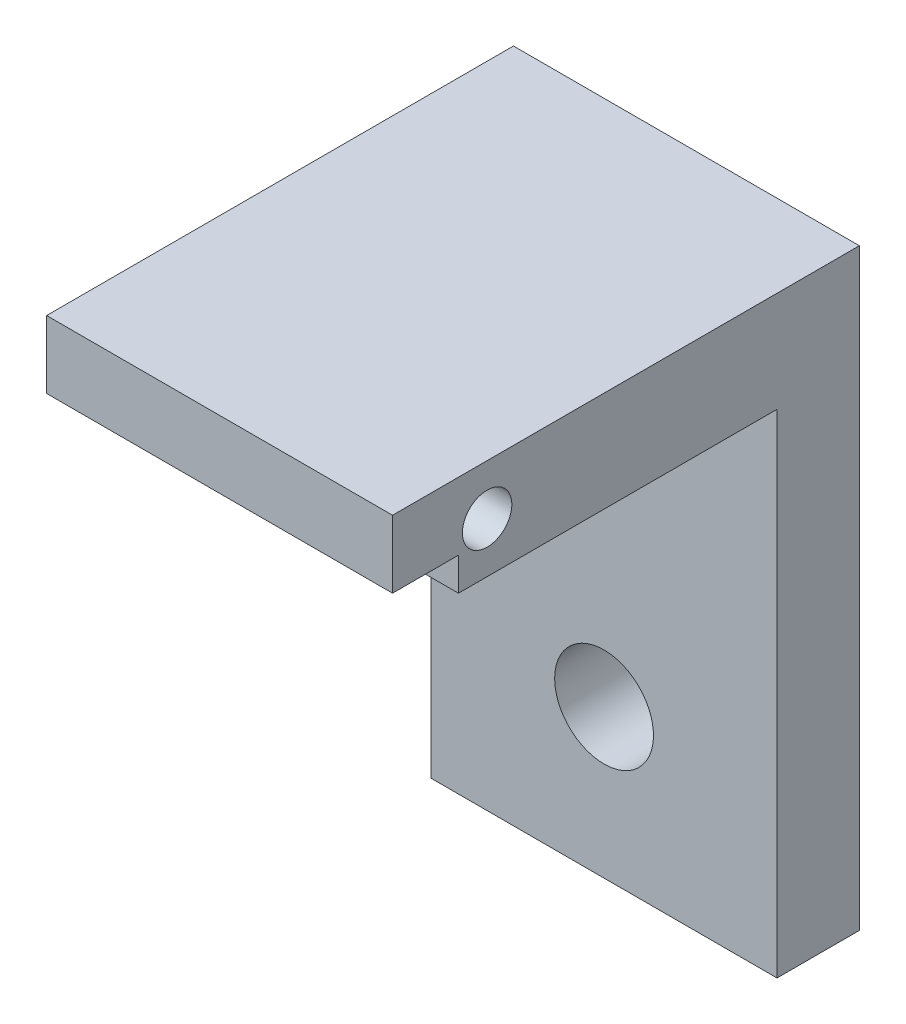
ISO-10303-21;
HEADER;
FILE_DESCRIPTION(('STEP AP214'),'2;1');
FILE_NAME('part.step','',(''),(''),'','','');
FILE_SCHEMA(('AUTOMOTIVE_DESIGN { 1 0 10303 214 1 1 1 1 }'));
ENDSEC;
DATA;
#1=APPLICATION_CONTEXT('core data for automotive mechanical design processes');
#2=APPLICATION_PROTOCOL_DEFINITION('international standard','automotive_design',2000,#1);
#3=PRODUCT_CONTEXT('',#1,'mechanical');
#4=PRODUCT('Part','Part','',(#3));
#5=PRODUCT_RELATED_PRODUCT_CATEGORY('part','',(#4));
#6=PRODUCT_DEFINITION_FORMATION('','',#4);
#7=PRODUCT_DEFINITION_CONTEXT('part definition',#1,'design');
#8=PRODUCT_DEFINITION('design','',#6,#7);
#9=PRODUCT_DEFINITION_SHAPE('','',#8);
#10=(LENGTH_UNIT() NAMED_UNIT(*) SI_UNIT(.MILLI.,.METRE.));
#11=(NAMED_UNIT(*) PLANE_ANGLE_UNIT() SI_UNIT($,.RADIAN.));
#12=(NAMED_UNIT(*) SI_UNIT($,.STERADIAN.) SOLID_ANGLE_UNIT());
#13=UNCERTAINTY_MEASURE_WITH_UNIT(LENGTH_MEASURE(1.E-05),#10,'distance_accuracy_value','');
#14=(GEOMETRIC_REPRESENTATION_CONTEXT(3) GLOBAL_UNCERTAINTY_ASSIGNED_CONTEXT((#13)) GLOBAL_UNIT_ASSIGNED_CONTEXT((#10,
#11,#12)) REPRESENTATION_CONTEXT('',''));
#15=CARTESIAN_POINT('',(0.,0.,0.));
#16=DIRECTION('',(0.,0.,1.));
#17=DIRECTION('',(1.,0.,0.));
#18=AXIS2_PLACEMENT_3D('',#15,#16,#17);
#19=CARTESIAN_POINT('',(-5.25000000000001,18.,2.5));
#20=DIRECTION('',(0.,0.,-1.));
#21=DIRECTION('',(-1.,0.,0.));
#22=AXIS2_PLACEMENT_3D('',#19,#20,#21);
#23=PLANE('',#22);
#24=CARTESIAN_POINT('',(0.,4.5,2.5));
#25=DIRECTION('',(0.,0.,-1.));
#26=DIRECTION('',(-1.,0.,0.));
#27=AXIS2_PLACEMENT_3D('',#24,#25,#26);
#28=CIRCLE('',#27,1.5);
#29=CARTESIAN_POINT('',(-1.5,4.5,2.5));
#30=VERTEX_POINT('',#29);
#31=EDGE_CURVE('E148',#30,#30,#28,.T.);
#32=ORIENTED_EDGE('',*,*,#31,.T.);
#33=EDGE_LOOP('',(#32));
#34=FACE_BOUND('',#33,.T.);
#35=DIRECTION('',(0.,-1.,0.));
#36=VECTOR('',#35,1.);
#37=CARTESIAN_POINT('',(5.24999999999999,18.,2.5));
#38=LINE('',#37,#36);
#39=CARTESIAN_POINT('',(5.24999999999999,14.95,2.5));
#40=VERTEX_POINT('',#39);
#41=CARTESIAN_POINT('',(5.24999999999999,0.,2.5));
#42=VERTEX_POINT('',#41);
#43=EDGE_CURVE('E184',#40,#42,#38,.T.);
#44=ORIENTED_EDGE('',*,*,#43,.F.);
#45=DIRECTION('',(-1.,0.,0.));
#46=VECTOR('',#45,1.);
#47=CARTESIAN_POINT('',(-5.25000000000001,14.95,2.5));
#48=LINE('',#47,#46);
#49=CARTESIAN_POINT('',(-5.25000000000001,14.95,2.5));
#50=VERTEX_POINT('',#49);
#51=EDGE_CURVE('E165',#40,#50,#48,.T.);
#52=ORIENTED_EDGE('',*,*,#51,.T.);
#53=DIRECTION('',(0.,-1.,0.));
#54=VECTOR('',#53,1.);
#55=CARTESIAN_POINT('',(-5.25000000000001,18.,2.5));
#56=LINE('',#55,#54);
#57=CARTESIAN_POINT('',(-5.25000000000001,0.,2.5));
#58=VERTEX_POINT('',#57);
#59=EDGE_CURVE('E54',#50,#58,#56,.T.);
#60=ORIENTED_EDGE('',*,*,#59,.T.);
#61=DIRECTION('',(1.,0.,0.));
#62=VECTOR('',#61,1.);
#63=CARTESIAN_POINT('',(-5.25000000000001,0.,2.5));
#64=LINE('',#63,#62);
#65=EDGE_CURVE('E181',#58,#42,#64,.T.);
#66=ORIENTED_EDGE('',*,*,#65,.T.);
#67=EDGE_LOOP('',(#44,#52,#60,#66));
#68=FACE_BOUND('',#67,.T.);
#69=ADVANCED_FACE('F45',(#34,#68),#23,.F.);
#70=CARTESIAN_POINT('',(5.24999999999999,18.,2.5));
#71=DIRECTION('',(-1.,0.,0.));
#72=DIRECTION('',(0.,0.,1.));
#73=AXIS2_PLACEMENT_3D('',#70,#71,#72);
#74=PLANE('',#73);
#75=CARTESIAN_POINT('',(5.24999999999999,16.475,11.3));
#76=DIRECTION('',(-1.,0.,0.));
#77=DIRECTION('',(0.,0.,1.));
#78=AXIS2_PLACEMENT_3D('',#75,#76,#77);
#79=CIRCLE('',#78,0.75);
#80=CARTESIAN_POINT('',(5.24999999999999,16.475,12.05));
#81=VERTEX_POINT('',#80);
#82=EDGE_CURVE('E132',#81,#81,#79,.T.);
#83=ORIENTED_EDGE('',*,*,#82,.T.);
#84=EDGE_LOOP('',(#83));
#85=FACE_BOUND('',#84,.T.);
#86=DIRECTION('',(0.,0.,-1.));
#87=VECTOR('',#86,1.);
#88=CARTESIAN_POINT('',(5.24999999999999,15.95,2.5));
#89=LINE('',#88,#87);
#90=CARTESIAN_POINT('',(5.24999999999999,15.95,14.17));
#91=VERTEX_POINT('',#90);
#92=CARTESIAN_POINT('',(5.24999999999999,15.95,12.17));
#93=VERTEX_POINT('',#92);
#94=EDGE_CURVE('E60',#91,#93,#89,.T.);
#95=ORIENTED_EDGE('',*,*,#94,.T.);
#96=DIRECTION('',(0.,-1.,0.));
#97=VECTOR('',#96,1.);
#98=CARTESIAN_POINT('',(5.24999999999999,18.,12.17));
#99=LINE('',#98,#97);
#100=CARTESIAN_POINT('',(5.24999999999999,14.95,12.17));
#101=VERTEX_POINT('',#100);
#102=EDGE_CURVE('E219',#93,#101,#99,.T.);
#103=ORIENTED_EDGE('',*,*,#102,.T.);
#104=DIRECTION('',(0.,0.,1.));
#105=VECTOR('',#104,1.);
#106=CARTESIAN_POINT('',(5.24999999999999,14.95,2.5));
#107=LINE('',#106,#105);
#108=EDGE_CURVE('E169',#40,#101,#107,.T.);
#109=ORIENTED_EDGE('',*,*,#108,.F.);
#110=ORIENTED_EDGE('',*,*,#43,.T.);
#111=DIRECTION('',(0.,0.,-1.));
#112=VECTOR('',#111,1.);
#113=CARTESIAN_POINT('',(5.24999999999999,0.,2.5));
#114=LINE('',#113,#112);
#115=CARTESIAN_POINT('',(5.24999999999999,0.,0.));
#116=VERTEX_POINT('',#115);
#117=EDGE_CURVE('E173',#42,#116,#114,.T.);
#118=ORIENTED_EDGE('',*,*,#117,.T.);
#119=DIRECTION('',(0.,-1.,0.));
#120=VECTOR('',#119,1.);
#121=CARTESIAN_POINT('',(5.24999999999999,26.3,0.));
#122=LINE('',#121,#120);
#123=CARTESIAN_POINT('',(5.24999999999999,18.,0.));
#124=VERTEX_POINT('',#123);
#125=EDGE_CURVE('E68',#124,#116,#122,.T.);
#126=ORIENTED_EDGE('',*,*,#125,.F.);
#127=DIRECTION('',(0.,0.,-1.));
#128=VECTOR('',#127,1.);
#129=CARTESIAN_POINT('',(5.24999999999999,18.,2.5));
#130=LINE('',#129,#128);
#131=CARTESIAN_POINT('',(5.24999999999999,18.,14.17));
#132=VERTEX_POINT('',#131);
#133=EDGE_CURVE('E177',#132,#124,#130,.T.);
#134=ORIENTED_EDGE('',*,*,#133,.F.);
#135=DIRECTION('',(0.,1.,0.));
#136=VECTOR('',#135,1.);
#137=CARTESIAN_POINT('',(5.24999999999999,18.,14.17));
#138=LINE('',#137,#136);
#139=EDGE_CURVE('E131',#91,#132,#138,.T.);
#140=ORIENTED_EDGE('',*,*,#139,.F.);
#141=EDGE_LOOP('',(#95,#103,#109,#110,#118,#126,#134,#140));
#142=FACE_BOUND('',#141,.T.);
#143=ADVANCED_FACE('F47',(#85,#142),#74,.F.);
#144=CARTESIAN_POINT('',(-5.25000000000001,18.,2.5));
#145=DIRECTION('',(1.,0.,0.));
#146=DIRECTION('',(0.,0.,-1.));
#147=AXIS2_PLACEMENT_3D('',#144,#145,#146);
#148=PLANE('',#147);
#149=CARTESIAN_POINT('',(-5.25000000000001,16.475,11.3));
#150=DIRECTION('',(-1.,0.,0.));
#151=DIRECTION('',(0.,0.,1.));
#152=AXIS2_PLACEMENT_3D('',#149,#150,#151);
#153=CIRCLE('',#152,0.75);
#154=CARTESIAN_POINT('',(-5.25000000000001,16.475,12.05));
#155=VERTEX_POINT('',#154);
#156=EDGE_CURVE('E138',#155,#155,#153,.T.);
#157=ORIENTED_EDGE('',*,*,#156,.F.);
#158=EDGE_LOOP('',(#157));
#159=FACE_BOUND('',#158,.T.);
#160=DIRECTION('',(0.,0.,1.));
#161=VECTOR('',#160,1.);
#162=CARTESIAN_POINT('',(-5.25000000000001,14.95,2.5));
#163=LINE('',#162,#161);
#164=CARTESIAN_POINT('',(-5.25000000000001,14.95,12.17));
#165=VERTEX_POINT('',#164);
#166=EDGE_CURVE('E170',#50,#165,#163,.T.);
#167=ORIENTED_EDGE('',*,*,#166,.T.);
#168=DIRECTION('',(0.,-1.,0.));
#169=VECTOR('',#168,1.);
#170=CARTESIAN_POINT('',(-5.25000000000001,14.95,12.17));
#171=LINE('',#170,#169);
#172=CARTESIAN_POINT('',(-5.25000000000001,15.95,12.17));
#173=VERTEX_POINT('',#172);
#174=EDGE_CURVE('E123',#173,#165,#171,.T.);
#175=ORIENTED_EDGE('',*,*,#174,.F.);
#176=DIRECTION('',(0.,0.,-1.));
#177=VECTOR('',#176,1.);
#178=CARTESIAN_POINT('',(-5.25000000000001,15.95,14.17));
#179=LINE('',#178,#177);
#180=CARTESIAN_POINT('',(-5.25000000000001,15.95,14.17));
#181=VERTEX_POINT('',#180);
#182=EDGE_CURVE('E112',#181,#173,#179,.T.);
#183=ORIENTED_EDGE('',*,*,#182,.F.);
#184=DIRECTION('',(0.,-1.,0.));
#185=VECTOR('',#184,1.);
#186=CARTESIAN_POINT('',(-5.25000000000001,18.,14.17));
#187=LINE('',#186,#185);
#188=CARTESIAN_POINT('',(-5.25000000000001,18.,14.17));
#189=VERTEX_POINT('',#188);
#190=EDGE_CURVE('E122',#189,#181,#187,.T.);
#191=ORIENTED_EDGE('',*,*,#190,.F.);
#192=DIRECTION('',(0.,0.,1.));
#193=VECTOR('',#192,1.);
#194=CARTESIAN_POINT('',(-5.25000000000001,18.,2.5));
#195=LINE('',#194,#193);
#196=CARTESIAN_POINT('',(-5.25000000000001,18.,0.));
#197=VERTEX_POINT('',#196);
#198=EDGE_CURVE('E180',#197,#189,#195,.T.);
#199=ORIENTED_EDGE('',*,*,#198,.F.);
#200=DIRECTION('',(0.,-1.,0.));
#201=VECTOR('',#200,1.);
#202=CARTESIAN_POINT('',(-5.25000000000001,26.3,0.));
#203=LINE('',#202,#201);
#204=CARTESIAN_POINT('',(-5.25000000000001,0.,0.));
#205=VERTEX_POINT('',#204);
#206=EDGE_CURVE('E155',#197,#205,#203,.T.);
#207=ORIENTED_EDGE('',*,*,#206,.T.);
#208=DIRECTION('',(0.,0.,1.));
#209=VECTOR('',#208,1.);
#210=CARTESIAN_POINT('',(-5.25000000000001,0.,2.5));
#211=LINE('',#210,#209);
#212=EDGE_CURVE('E188',#205,#58,#211,.T.);
#213=ORIENTED_EDGE('',*,*,#212,.T.);
#214=ORIENTED_EDGE('',*,*,#59,.F.);
#215=EDGE_LOOP('',(#167,#175,#183,#191,#199,#207,#213,#214));
#216=FACE_BOUND('',#215,.T.);
#217=ADVANCED_FACE('F120',(#159,#216),#148,.F.);
#218=CARTESIAN_POINT('',(0.,18.,0.));
#219=DIRECTION('',(0.,-1.,0.));
#220=DIRECTION('',(0.,0.,-1.));
#221=AXIS2_PLACEMENT_3D('',#218,#219,#220);
#222=PLANE('',#221);
#223=ORIENTED_EDGE('',*,*,#198,.T.);
#224=DIRECTION('',(-1.,0.,0.));
#225=VECTOR('',#224,1.);
#226=CARTESIAN_POINT('',(-5.25000000000001,18.,14.17));
#227=LINE('',#226,#225);
#228=EDGE_CURVE('E129',#132,#189,#227,.T.);
#229=ORIENTED_EDGE('',*,*,#228,.F.);
#230=ORIENTED_EDGE('',*,*,#133,.T.);
#231=DIRECTION('',(-1.,0.,0.));
#232=VECTOR('',#231,1.);
#233=CARTESIAN_POINT('',(0.,18.,0.));
#234=LINE('',#233,#232);
#235=EDGE_CURVE('E159',#124,#197,#234,.T.);
#236=ORIENTED_EDGE('',*,*,#235,.T.);
#237=EDGE_LOOP('',(#223,#229,#230,#236));
#238=FACE_BOUND('',#237,.T.);
#239=ADVANCED_FACE('F233',(#238),#222,.F.);
#240=CARTESIAN_POINT('',(0.,0.,0.));
#241=DIRECTION('',(0.,-1.,0.));
#242=DIRECTION('',(0.,0.,-1.));
#243=AXIS2_PLACEMENT_3D('',#240,#241,#242);
#244=PLANE('',#243);
#245=DIRECTION('',(-1.,0.,0.));
#246=VECTOR('',#245,1.);
#247=CARTESIAN_POINT('',(-5.25000000000001,0.,0.));
#248=LINE('',#247,#246);
#249=EDGE_CURVE('E152',#116,#205,#248,.T.);
#250=ORIENTED_EDGE('',*,*,#249,.F.);
#251=ORIENTED_EDGE('',*,*,#117,.F.);
#252=ORIENTED_EDGE('',*,*,#65,.F.);
#253=ORIENTED_EDGE('',*,*,#212,.F.);
#254=EDGE_LOOP('',(#250,#251,#252,#253));
#255=FACE_BOUND('',#254,.T.);
#256=ADVANCED_FACE('F204',(#255),#244,.T.);
#257=CARTESIAN_POINT('',(-5.25000000000001,14.95,2.5));
#258=DIRECTION('',(0.,1.,0.));
#259=DIRECTION('',(0.,0.,1.));
#260=AXIS2_PLACEMENT_3D('',#257,#258,#259);
#261=PLANE('',#260);
#262=ORIENTED_EDGE('',*,*,#108,.T.);
#263=DIRECTION('',(-1.,0.,0.));
#264=VECTOR('',#263,1.);
#265=CARTESIAN_POINT('',(7.24999999999999,14.95,12.17));
#266=LINE('',#265,#264);
#267=EDGE_CURVE('E212',#101,#165,#266,.T.);
#268=ORIENTED_EDGE('',*,*,#267,.T.);
#269=ORIENTED_EDGE('',*,*,#166,.F.);
#270=ORIENTED_EDGE('',*,*,#51,.F.);
#271=EDGE_LOOP('',(#262,#268,#269,#270));
#272=FACE_BOUND('',#271,.T.);
#273=ADVANCED_FACE('F210',(#272),#261,.F.);
#274=CARTESIAN_POINT('',(-5.25000000000001,26.3,0.));
#275=DIRECTION('',(0.,0.,1.));
#276=DIRECTION('',(1.,0.,0.));
#277=AXIS2_PLACEMENT_3D('',#274,#275,#276);
#278=PLANE('',#277);
#279=CARTESIAN_POINT('',(0.,4.5,0.));
#280=DIRECTION('',(0.,0.,-1.));
#281=DIRECTION('',(-1.,0.,0.));
#282=AXIS2_PLACEMENT_3D('',#279,#280,#281);
#283=CIRCLE('',#282,1.5);
#284=CARTESIAN_POINT('',(-1.5,4.5,0.));
#285=VERTEX_POINT('',#284);
#286=EDGE_CURVE('E144',#285,#285,#283,.T.);
#287=ORIENTED_EDGE('',*,*,#286,.F.);
#288=EDGE_LOOP('',(#287));
#289=FACE_BOUND('',#288,.T.);
#290=ORIENTED_EDGE('',*,*,#125,.T.);
#291=ORIENTED_EDGE('',*,*,#249,.T.);
#292=ORIENTED_EDGE('',*,*,#206,.F.);
#293=ORIENTED_EDGE('',*,*,#235,.F.);
#294=EDGE_LOOP('',(#290,#291,#292,#293));
#295=FACE_BOUND('',#294,.T.);
#296=ADVANCED_FACE('F252',(#289,#295),#278,.F.);
#297=CARTESIAN_POINT('',(0.,4.5,26.3));
#298=DIRECTION('',(0.,0.,-1.));
#299=DIRECTION('',(-1.,0.,0.));
#300=AXIS2_PLACEMENT_3D('',#297,#298,#299);
#301=CYLINDRICAL_SURFACE('',#300,1.5);
#302=ORIENTED_EDGE('',*,*,#286,.T.);
#303=EDGE_LOOP('',(#302));
#304=FACE_BOUND('',#303,.T.);
#305=ORIENTED_EDGE('',*,*,#31,.F.);
#306=EDGE_LOOP('',(#305));
#307=FACE_BOUND('',#306,.T.);
#308=ADVANCED_FACE('F254',(#304,#307),#301,.F.);
#309=CARTESIAN_POINT('',(0.,0.,14.17));
#310=DIRECTION('',(0.,0.,1.));
#311=DIRECTION('',(1.,0.,0.));
#312=AXIS2_PLACEMENT_3D('',#309,#310,#311);
#313=PLANE('',#312);
#314=DIRECTION('',(-1.,0.,0.));
#315=VECTOR('',#314,1.);
#316=CARTESIAN_POINT('',(0.,15.95,14.17));
#317=LINE('',#316,#315);
#318=EDGE_CURVE('E11',#91,#181,#317,.T.);
#319=ORIENTED_EDGE('',*,*,#318,.F.);
#320=ORIENTED_EDGE('',*,*,#139,.T.);
#321=ORIENTED_EDGE('',*,*,#228,.T.);
#322=ORIENTED_EDGE('',*,*,#190,.T.);
#323=EDGE_LOOP('',(#319,#320,#321,#322));
#324=FACE_BOUND('',#323,.T.);
#325=ADVANCED_FACE('F127',(#324),#313,.T.);
#326=CARTESIAN_POINT('',(7.24999999999999,16.475,11.3));
#327=DIRECTION('',(-1.,0.,0.));
#328=DIRECTION('',(0.,0.,1.));
#329=AXIS2_PLACEMENT_3D('',#326,#327,#328);
#330=CYLINDRICAL_SURFACE('',#329,0.75);
#331=ORIENTED_EDGE('',*,*,#156,.T.);
#332=EDGE_LOOP('',(#331));
#333=FACE_BOUND('',#332,.T.);
#334=ORIENTED_EDGE('',*,*,#82,.F.);
#335=EDGE_LOOP('',(#334));
#336=FACE_BOUND('',#335,.T.);
#337=ADVANCED_FACE('F229',(#333,#336),#330,.F.);
#338=CARTESIAN_POINT('',(7.24999999999999,14.95,12.17));
#339=DIRECTION('',(0.,0.,-1.));
#340=DIRECTION('',(-1.,0.,0.));
#341=AXIS2_PLACEMENT_3D('',#338,#339,#340);
#342=PLANE('',#341);
#343=DIRECTION('',(-1.,0.,0.));
#344=VECTOR('',#343,1.);
#345=CARTESIAN_POINT('',(7.24999999999999,15.95,12.17));
#346=LINE('',#345,#344);
#347=EDGE_CURVE('E215',#93,#173,#346,.T.);
#348=ORIENTED_EDGE('',*,*,#347,.T.);
#349=ORIENTED_EDGE('',*,*,#174,.T.);
#350=ORIENTED_EDGE('',*,*,#267,.F.);
#351=ORIENTED_EDGE('',*,*,#102,.F.);
#352=EDGE_LOOP('',(#348,#349,#350,#351));
#353=FACE_BOUND('',#352,.T.);
#354=ADVANCED_FACE('F263',(#353),#342,.F.);
#355=CARTESIAN_POINT('',(7.24999999999999,15.95,14.17));
#356=DIRECTION('',(0.,1.,0.));
#357=DIRECTION('',(0.,0.,1.));
#358=AXIS2_PLACEMENT_3D('',#355,#356,#357);
#359=PLANE('',#358);
#360=ORIENTED_EDGE('',*,*,#318,.T.);
#361=ORIENTED_EDGE('',*,*,#182,.T.);
#362=ORIENTED_EDGE('',*,*,#347,.F.);
#363=ORIENTED_EDGE('',*,*,#94,.F.);
#364=EDGE_LOOP('',(#360,#361,#362,#363));
#365=FACE_BOUND('',#364,.T.);
#366=ADVANCED_FACE('F111',(#365),#359,.F.);
#367=CLOSED_SHELL('',(#69,#143,#217,#239,#256,#273,#296,#308,#325,#337,#354,#366));
#368=MANIFOLD_SOLID_BREP('B2',#367);
#369=ADVANCED_BREP_SHAPE_REPRESENTATION('',(#18,#368),#14);
#370=SHAPE_DEFINITION_REPRESENTATION(#9,#369);
ENDSEC;
END-ISO-10303-21;
